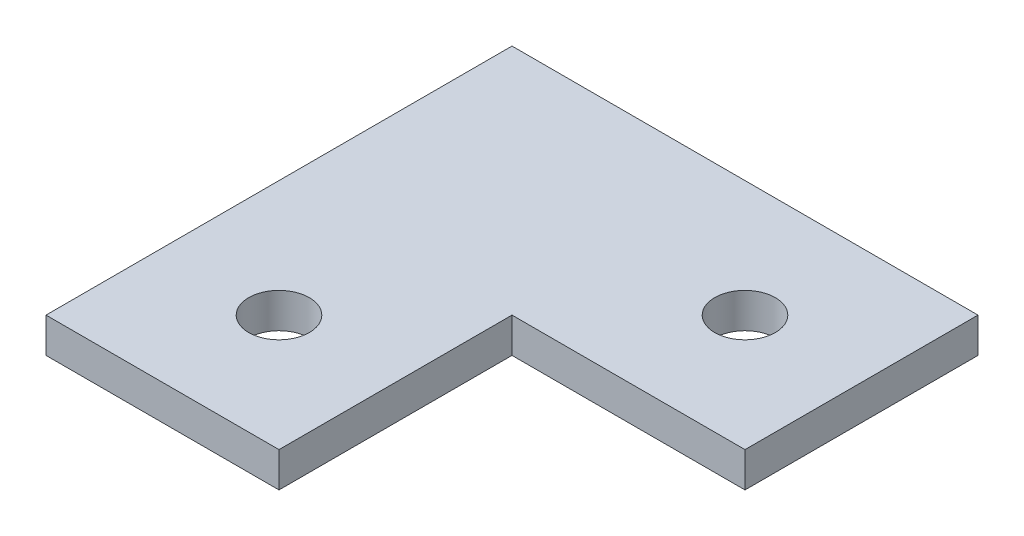
ISO-10303-21;
HEADER;
FILE_DESCRIPTION(('STEP AP214'),'2;1');
FILE_NAME('part.step','',(''),(''),'','','');
FILE_SCHEMA(('AUTOMOTIVE_DESIGN { 1 0 10303 214 1 1 1 1 }'));
ENDSEC;
DATA;
#1=APPLICATION_CONTEXT('core data for automotive mechanical design processes');
#2=APPLICATION_PROTOCOL_DEFINITION('international standard','automotive_design',2000,#1);
#3=PRODUCT_CONTEXT('',#1,'mechanical');
#4=PRODUCT('Part','Part','',(#3));
#5=PRODUCT_RELATED_PRODUCT_CATEGORY('part','',(#4));
#6=PRODUCT_DEFINITION_FORMATION('','',#4);
#7=PRODUCT_DEFINITION_CONTEXT('part definition',#1,'design');
#8=PRODUCT_DEFINITION('design','',#6,#7);
#9=PRODUCT_DEFINITION_SHAPE('','',#8);
#10=(LENGTH_UNIT() NAMED_UNIT(*) SI_UNIT(.MILLI.,.METRE.));
#11=(NAMED_UNIT(*) PLANE_ANGLE_UNIT() SI_UNIT($,.RADIAN.));
#12=(NAMED_UNIT(*) SI_UNIT($,.STERADIAN.) SOLID_ANGLE_UNIT());
#13=UNCERTAINTY_MEASURE_WITH_UNIT(LENGTH_MEASURE(1.E-05),#10,'distance_accuracy_value','');
#14=(GEOMETRIC_REPRESENTATION_CONTEXT(3) GLOBAL_UNCERTAINTY_ASSIGNED_CONTEXT((#13)) GLOBAL_UNIT_ASSIGNED_CONTEXT((#10,
#11,#12)) REPRESENTATION_CONTEXT('',''));
#15=CARTESIAN_POINT('',(0.,0.,0.));
#16=DIRECTION('',(0.,0.,1.));
#17=DIRECTION('',(1.,0.,0.));
#18=AXIS2_PLACEMENT_3D('',#15,#16,#17);
#19=CARTESIAN_POINT('',(0.,3.,0.));
#20=DIRECTION('',(0.,1.,0.));
#21=DIRECTION('',(0.,0.,1.));
#22=AXIS2_PLACEMENT_3D('',#19,#20,#21);
#23=PLANE('',#22);
#24=CARTESIAN_POINT('',(-10.,3.,10.));
#25=DIRECTION('',(0.,1.,0.));
#26=DIRECTION('',(0.,0.,1.));
#27=AXIS2_PLACEMENT_3D('',#24,#25,#26);
#28=CIRCLE('',#27,2.60000000000008);
#29=CARTESIAN_POINT('',(-10.,3.,12.6000000000001));
#30=VERTEX_POINT('',#29);
#31=EDGE_CURVE('E128',#30,#30,#28,.T.);
#32=ORIENTED_EDGE('',*,*,#31,.F.);
#33=EDGE_LOOP('',(#32));
#34=FACE_BOUND('',#33,.T.);
#35=DIRECTION('',(-1.,0.,0.));
#36=VECTOR('',#35,1.);
#37=CARTESIAN_POINT('',(20.,3.,-20.));
#38=LINE('',#37,#36);
#39=CARTESIAN_POINT('',(20.,3.,-20.));
#40=VERTEX_POINT('',#39);
#41=CARTESIAN_POINT('',(-20.,3.,-20.));
#42=VERTEX_POINT('',#41);
#43=EDGE_CURVE('E135',#40,#42,#38,.T.);
#44=ORIENTED_EDGE('',*,*,#43,.T.);
#45=DIRECTION('',(0.,0.,1.));
#46=VECTOR('',#45,1.);
#47=CARTESIAN_POINT('',(-20.,3.,-20.));
#48=LINE('',#47,#46);
#49=CARTESIAN_POINT('',(-20.,3.,20.));
#50=VERTEX_POINT('',#49);
#51=EDGE_CURVE('E93',#42,#50,#48,.T.);
#52=ORIENTED_EDGE('',*,*,#51,.T.);
#53=DIRECTION('',(1.,0.,0.));
#54=VECTOR('',#53,1.);
#55=CARTESIAN_POINT('',(-20.,3.,20.));
#56=LINE('',#55,#54);
#57=CARTESIAN_POINT('',(0.,3.,20.));
#58=VERTEX_POINT('',#57);
#59=EDGE_CURVE('E106',#50,#58,#56,.T.);
#60=ORIENTED_EDGE('',*,*,#59,.T.);
#61=DIRECTION('',(0.,0.,-1.));
#62=VECTOR('',#61,1.);
#63=CARTESIAN_POINT('',(0.,3.,20.));
#64=LINE('',#63,#62);
#65=CARTESIAN_POINT('',(0.,3.,0.));
#66=VERTEX_POINT('',#65);
#67=EDGE_CURVE('E100',#58,#66,#64,.T.);
#68=ORIENTED_EDGE('',*,*,#67,.T.);
#69=DIRECTION('',(1.,0.,0.));
#70=VECTOR('',#69,1.);
#71=CARTESIAN_POINT('',(0.,3.,0.));
#72=LINE('',#71,#70);
#73=CARTESIAN_POINT('',(20.,3.,0.));
#74=VERTEX_POINT('',#73);
#75=EDGE_CURVE('E104',#66,#74,#72,.T.);
#76=ORIENTED_EDGE('',*,*,#75,.T.);
#77=DIRECTION('',(0.,0.,-1.));
#78=VECTOR('',#77,1.);
#79=CARTESIAN_POINT('',(20.,3.,0.));
#80=LINE('',#79,#78);
#81=EDGE_CURVE('E56',#74,#40,#80,.T.);
#82=ORIENTED_EDGE('',*,*,#81,.T.);
#83=EDGE_LOOP('',(#44,#52,#60,#68,#76,#82));
#84=FACE_BOUND('',#83,.T.);
#85=CARTESIAN_POINT('',(10.,3.,-10.));
#86=DIRECTION('',(0.,1.,0.));
#87=DIRECTION('',(0.,0.,1.));
#88=AXIS2_PLACEMENT_3D('',#85,#86,#87);
#89=CIRCLE('',#88,2.60000000000008);
#90=CARTESIAN_POINT('',(10.,3.,-7.39999999999993));
#91=VERTEX_POINT('',#90);
#92=EDGE_CURVE('E177',#91,#91,#89,.T.);
#93=ORIENTED_EDGE('',*,*,#92,.F.);
#94=EDGE_LOOP('',(#93));
#95=FACE_BOUND('',#94,.T.);
#96=ADVANCED_FACE('F39',(#34,#84,#95),#23,.T.);
#97=CARTESIAN_POINT('',(0.,0.,0.));
#98=DIRECTION('',(0.,1.,0.));
#99=DIRECTION('',(0.,0.,1.));
#100=AXIS2_PLACEMENT_3D('',#97,#98,#99);
#101=PLANE('',#100);
#102=DIRECTION('',(-1.,0.,0.));
#103=VECTOR('',#102,1.);
#104=CARTESIAN_POINT('',(20.,0.,-20.));
#105=LINE('',#104,#103);
#106=CARTESIAN_POINT('',(20.,0.,-20.));
#107=VERTEX_POINT('',#106);
#108=CARTESIAN_POINT('',(-20.,0.,-20.));
#109=VERTEX_POINT('',#108);
#110=EDGE_CURVE('E124',#107,#109,#105,.T.);
#111=ORIENTED_EDGE('',*,*,#110,.F.);
#112=DIRECTION('',(0.,0.,-1.));
#113=VECTOR('',#112,1.);
#114=CARTESIAN_POINT('',(20.,0.,0.));
#115=LINE('',#114,#113);
#116=CARTESIAN_POINT('',(20.,0.,0.));
#117=VERTEX_POINT('',#116);
#118=EDGE_CURVE('E85',#117,#107,#115,.T.);
#119=ORIENTED_EDGE('',*,*,#118,.F.);
#120=DIRECTION('',(1.,0.,0.));
#121=VECTOR('',#120,1.);
#122=CARTESIAN_POINT('',(0.,0.,0.));
#123=LINE('',#122,#121);
#124=CARTESIAN_POINT('',(0.,0.,0.));
#125=VERTEX_POINT('',#124);
#126=EDGE_CURVE('E79',#125,#117,#123,.T.);
#127=ORIENTED_EDGE('',*,*,#126,.F.);
#128=DIRECTION('',(0.,0.,-1.));
#129=VECTOR('',#128,1.);
#130=CARTESIAN_POINT('',(0.,0.,20.));
#131=LINE('',#130,#129);
#132=CARTESIAN_POINT('',(0.,0.,20.));
#133=VERTEX_POINT('',#132);
#134=EDGE_CURVE('E114',#133,#125,#131,.T.);
#135=ORIENTED_EDGE('',*,*,#134,.F.);
#136=DIRECTION('',(1.,0.,0.));
#137=VECTOR('',#136,1.);
#138=CARTESIAN_POINT('',(-20.,0.,20.));
#139=LINE('',#138,#137);
#140=CARTESIAN_POINT('',(-20.,0.,20.));
#141=VERTEX_POINT('',#140);
#142=EDGE_CURVE('E130',#141,#133,#139,.T.);
#143=ORIENTED_EDGE('',*,*,#142,.F.);
#144=DIRECTION('',(0.,0.,1.));
#145=VECTOR('',#144,1.);
#146=CARTESIAN_POINT('',(-20.,0.,-20.));
#147=LINE('',#146,#145);
#148=EDGE_CURVE('E127',#109,#141,#147,.T.);
#149=ORIENTED_EDGE('',*,*,#148,.F.);
#150=EDGE_LOOP('',(#111,#119,#127,#135,#143,#149));
#151=FACE_BOUND('',#150,.T.);
#152=CARTESIAN_POINT('',(-10.,0.,10.));
#153=DIRECTION('',(0.,1.,0.));
#154=DIRECTION('',(0.,0.,1.));
#155=AXIS2_PLACEMENT_3D('',#152,#153,#154);
#156=CIRCLE('',#155,2.60000000000008);
#157=CARTESIAN_POINT('',(-10.,0.,12.6000000000001));
#158=VERTEX_POINT('',#157);
#159=EDGE_CURVE('E183',#158,#158,#156,.T.);
#160=ORIENTED_EDGE('',*,*,#159,.T.);
#161=EDGE_LOOP('',(#160));
#162=FACE_BOUND('',#161,.T.);
#163=CARTESIAN_POINT('',(10.,0.,-10.));
#164=DIRECTION('',(0.,1.,0.));
#165=DIRECTION('',(0.,0.,1.));
#166=AXIS2_PLACEMENT_3D('',#163,#164,#165);
#167=CIRCLE('',#166,2.60000000000008);
#168=CARTESIAN_POINT('',(10.,0.,-7.39999999999993));
#169=VERTEX_POINT('',#168);
#170=EDGE_CURVE('E180',#169,#169,#167,.T.);
#171=ORIENTED_EDGE('',*,*,#170,.T.);
#172=EDGE_LOOP('',(#171));
#173=FACE_BOUND('',#172,.T.);
#174=ADVANCED_FACE('F144',(#151,#162,#173),#101,.F.);
#175=CARTESIAN_POINT('',(20.,3.,-20.));
#176=DIRECTION('',(0.,0.,1.));
#177=DIRECTION('',(1.,0.,0.));
#178=AXIS2_PLACEMENT_3D('',#175,#176,#177);
#179=PLANE('',#178);
#180=ORIENTED_EDGE('',*,*,#110,.T.);
#181=DIRECTION('',(0.,-1.,0.));
#182=VECTOR('',#181,1.);
#183=CARTESIAN_POINT('',(-20.,3.,-20.));
#184=LINE('',#183,#182);
#185=EDGE_CURVE('E11',#42,#109,#184,.T.);
#186=ORIENTED_EDGE('',*,*,#185,.F.);
#187=ORIENTED_EDGE('',*,*,#43,.F.);
#188=DIRECTION('',(0.,-1.,0.));
#189=VECTOR('',#188,1.);
#190=CARTESIAN_POINT('',(20.,3.,-20.));
#191=LINE('',#190,#189);
#192=EDGE_CURVE('E120',#40,#107,#191,.T.);
#193=ORIENTED_EDGE('',*,*,#192,.T.);
#194=EDGE_LOOP('',(#180,#186,#187,#193));
#195=FACE_BOUND('',#194,.T.);
#196=ADVANCED_FACE('F41',(#195),#179,.F.);
#197=CARTESIAN_POINT('',(-20.,3.,-20.));
#198=DIRECTION('',(1.,0.,0.));
#199=DIRECTION('',(0.,0.,-1.));
#200=AXIS2_PLACEMENT_3D('',#197,#198,#199);
#201=PLANE('',#200);
#202=ORIENTED_EDGE('',*,*,#148,.T.);
#203=DIRECTION('',(0.,-1.,0.));
#204=VECTOR('',#203,1.);
#205=CARTESIAN_POINT('',(-20.,3.,20.));
#206=LINE('',#205,#204);
#207=EDGE_CURVE('E48',#50,#141,#206,.T.);
#208=ORIENTED_EDGE('',*,*,#207,.F.);
#209=ORIENTED_EDGE('',*,*,#51,.F.);
#210=ORIENTED_EDGE('',*,*,#185,.T.);
#211=EDGE_LOOP('',(#202,#208,#209,#210));
#212=FACE_BOUND('',#211,.T.);
#213=ADVANCED_FACE('F228',(#212),#201,.F.);
#214=CARTESIAN_POINT('',(-20.,3.,20.));
#215=DIRECTION('',(0.,0.,-1.));
#216=DIRECTION('',(-1.,0.,0.));
#217=AXIS2_PLACEMENT_3D('',#214,#215,#216);
#218=PLANE('',#217);
#219=ORIENTED_EDGE('',*,*,#142,.T.);
#220=DIRECTION('',(0.,-1.,0.));
#221=VECTOR('',#220,1.);
#222=CARTESIAN_POINT('',(0.,3.,20.));
#223=LINE('',#222,#221);
#224=EDGE_CURVE('E115',#58,#133,#223,.T.);
#225=ORIENTED_EDGE('',*,*,#224,.F.);
#226=ORIENTED_EDGE('',*,*,#59,.F.);
#227=ORIENTED_EDGE('',*,*,#207,.T.);
#228=EDGE_LOOP('',(#219,#225,#226,#227));
#229=FACE_BOUND('',#228,.T.);
#230=ADVANCED_FACE('F141',(#229),#218,.F.);
#231=CARTESIAN_POINT('',(0.,3.,20.));
#232=DIRECTION('',(-1.,0.,0.));
#233=DIRECTION('',(0.,0.,1.));
#234=AXIS2_PLACEMENT_3D('',#231,#232,#233);
#235=PLANE('',#234);
#236=ORIENTED_EDGE('',*,*,#134,.T.);
#237=DIRECTION('',(0.,-1.,0.));
#238=VECTOR('',#237,1.);
#239=CARTESIAN_POINT('',(0.,3.,0.));
#240=LINE('',#239,#238);
#241=EDGE_CURVE('E111',#66,#125,#240,.T.);
#242=ORIENTED_EDGE('',*,*,#241,.F.);
#243=ORIENTED_EDGE('',*,*,#67,.F.);
#244=ORIENTED_EDGE('',*,*,#224,.T.);
#245=EDGE_LOOP('',(#236,#242,#243,#244));
#246=FACE_BOUND('',#245,.T.);
#247=ADVANCED_FACE('F112',(#246),#235,.F.);
#248=CARTESIAN_POINT('',(0.,3.,0.));
#249=DIRECTION('',(0.,0.,-1.));
#250=DIRECTION('',(-1.,0.,0.));
#251=AXIS2_PLACEMENT_3D('',#248,#249,#250);
#252=PLANE('',#251);
#253=ORIENTED_EDGE('',*,*,#126,.T.);
#254=DIRECTION('',(0.,-1.,0.));
#255=VECTOR('',#254,1.);
#256=CARTESIAN_POINT('',(20.,3.,0.));
#257=LINE('',#256,#255);
#258=EDGE_CURVE('E116',#74,#117,#257,.T.);
#259=ORIENTED_EDGE('',*,*,#258,.F.);
#260=ORIENTED_EDGE('',*,*,#75,.F.);
#261=ORIENTED_EDGE('',*,*,#241,.T.);
#262=EDGE_LOOP('',(#253,#259,#260,#261));
#263=FACE_BOUND('',#262,.T.);
#264=ADVANCED_FACE('F118',(#263),#252,.F.);
#265=CARTESIAN_POINT('',(20.,3.,0.));
#266=DIRECTION('',(-1.,0.,0.));
#267=DIRECTION('',(0.,0.,1.));
#268=AXIS2_PLACEMENT_3D('',#265,#266,#267);
#269=PLANE('',#268);
#270=ORIENTED_EDGE('',*,*,#118,.T.);
#271=ORIENTED_EDGE('',*,*,#192,.F.);
#272=ORIENTED_EDGE('',*,*,#81,.F.);
#273=ORIENTED_EDGE('',*,*,#258,.T.);
#274=EDGE_LOOP('',(#270,#271,#272,#273));
#275=FACE_BOUND('',#274,.T.);
#276=ADVANCED_FACE('F149',(#275),#269,.F.);
#277=CARTESIAN_POINT('',(-10.,3.,10.));
#278=DIRECTION('',(0.,-1.,0.));
#279=DIRECTION('',(0.,0.,-1.));
#280=AXIS2_PLACEMENT_3D('',#277,#278,#279);
#281=CYLINDRICAL_SURFACE('',#280,2.60000000000008);
#282=ORIENTED_EDGE('',*,*,#31,.T.);
#283=EDGE_LOOP('',(#282));
#284=FACE_BOUND('',#283,.T.);
#285=ORIENTED_EDGE('',*,*,#159,.F.);
#286=EDGE_LOOP('',(#285));
#287=FACE_BOUND('',#286,.T.);
#288=ADVANCED_FACE('F151',(#284,#287),#281,.F.);
#289=CARTESIAN_POINT('',(10.,3.,-10.));
#290=DIRECTION('',(0.,-1.,0.));
#291=DIRECTION('',(0.,0.,-1.));
#292=AXIS2_PLACEMENT_3D('',#289,#290,#291);
#293=CYLINDRICAL_SURFACE('',#292,2.60000000000008);
#294=ORIENTED_EDGE('',*,*,#92,.T.);
#295=EDGE_LOOP('',(#294));
#296=FACE_BOUND('',#295,.T.);
#297=ORIENTED_EDGE('',*,*,#170,.F.);
#298=EDGE_LOOP('',(#297));
#299=FACE_BOUND('',#298,.T.);
#300=ADVANCED_FACE('F157',(#296,#299),#293,.F.);
#301=CLOSED_SHELL('',(#96,#174,#196,#213,#230,#247,#264,#276,#288,#300));
#302=MANIFOLD_SOLID_BREP('B2',#301);
#303=ADVANCED_BREP_SHAPE_REPRESENTATION('',(#18,#302),#14);
#304=SHAPE_DEFINITION_REPRESENTATION(#9,#303);
ENDSEC;
END-ISO-10303-21;
